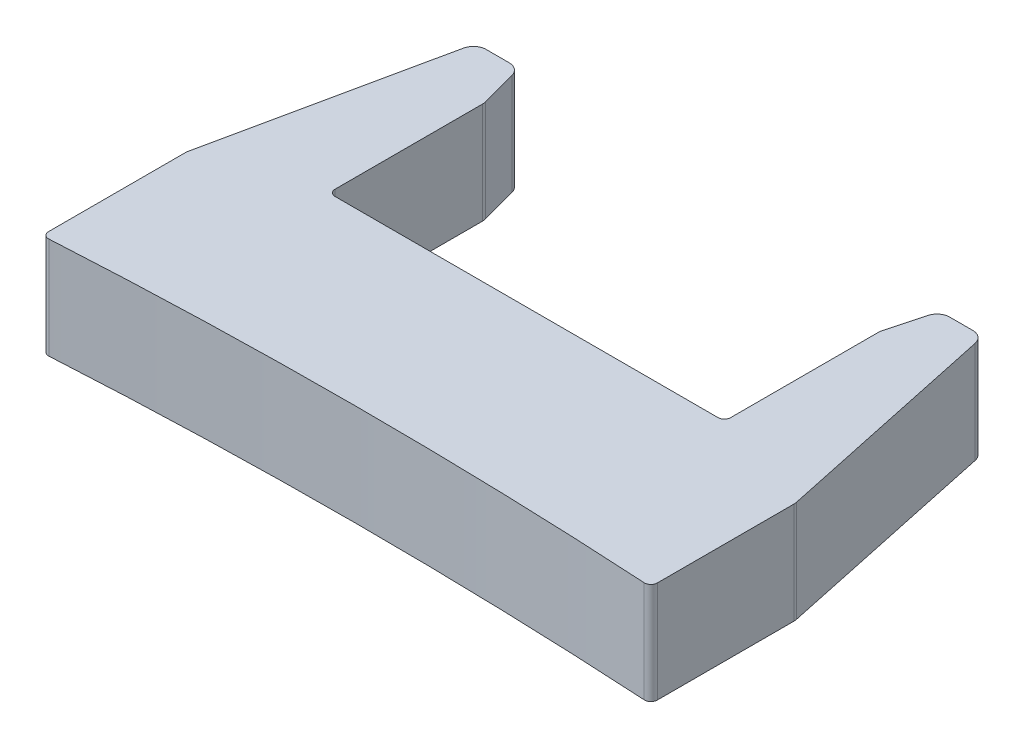
ISO-10303-21;
HEADER;
FILE_DESCRIPTION(('STEP AP214'),'2;1');
FILE_NAME('part.step','',(''),(''),'','','');
FILE_SCHEMA(('AUTOMOTIVE_DESIGN { 1 0 10303 214 1 1 1 1 }'));
ENDSEC;
DATA;
#1=APPLICATION_CONTEXT('core data for automotive mechanical design processes');
#2=APPLICATION_PROTOCOL_DEFINITION('international standard','automotive_design',2000,#1);
#3=PRODUCT_CONTEXT('',#1,'mechanical');
#4=PRODUCT('Part','Part','',(#3));
#5=PRODUCT_RELATED_PRODUCT_CATEGORY('part','',(#4));
#6=PRODUCT_DEFINITION_FORMATION('','',#4);
#7=PRODUCT_DEFINITION_CONTEXT('part definition',#1,'design');
#8=PRODUCT_DEFINITION('design','',#6,#7);
#9=PRODUCT_DEFINITION_SHAPE('','',#8);
#10=(LENGTH_UNIT() NAMED_UNIT(*) SI_UNIT(.MILLI.,.METRE.));
#11=(NAMED_UNIT(*) PLANE_ANGLE_UNIT() SI_UNIT($,.RADIAN.));
#12=(NAMED_UNIT(*) SI_UNIT($,.STERADIAN.) SOLID_ANGLE_UNIT());
#13=UNCERTAINTY_MEASURE_WITH_UNIT(LENGTH_MEASURE(1.E-05),#10,'distance_accuracy_value','');
#14=(GEOMETRIC_REPRESENTATION_CONTEXT(3) GLOBAL_UNCERTAINTY_ASSIGNED_CONTEXT((#13)) GLOBAL_UNIT_ASSIGNED_CONTEXT((#10,
#11,#12)) REPRESENTATION_CONTEXT('',''));
#15=CARTESIAN_POINT('',(0.,0.,0.));
#16=DIRECTION('',(0.,0.,1.));
#17=DIRECTION('',(1.,0.,0.));
#18=AXIS2_PLACEMENT_3D('',#15,#16,#17);
#19=CARTESIAN_POINT('',(-20.,4.,0.));
#20=DIRECTION('',(0.,0.,1.));
#21=DIRECTION('',(1.,0.,0.));
#22=AXIS2_PLACEMENT_3D('',#19,#20,#21);
#23=PLANE('',#22);
#24=CARTESIAN_POINT('',(0.,0.,0.));
#25=DIRECTION('',(0.,0.,-1.));
#26=DIRECTION('',(-1.,0.,0.));
#27=AXIS2_PLACEMENT_3D('',#24,#25,#26);
#28=CIRCLE('',#27,2.49999999999999);
#29=CARTESIAN_POINT('',(-2.49999999999999,0.,0.));
#30=VERTEX_POINT('',#29);
#31=EDGE_CURVE('E216',#30,#30,#28,.T.);
#32=ORIENTED_EDGE('',*,*,#31,.F.);
#33=EDGE_LOOP('',(#32));
#34=FACE_BOUND('',#33,.T.);
#35=DIRECTION('',(-1.,0.,0.));
#36=VECTOR('',#35,1.);
#37=CARTESIAN_POINT('',(-20.,-4.,0.));
#38=LINE('',#37,#36);
#39=CARTESIAN_POINT('',(15.1,-4.,0.));
#40=VERTEX_POINT('',#39);
#41=CARTESIAN_POINT('',(-15.1,-4.,0.));
#42=VERTEX_POINT('',#41);
#43=EDGE_CURVE('E258',#40,#42,#38,.T.);
#44=ORIENTED_EDGE('',*,*,#43,.T.);
#45=DIRECTION('',(0.,1.,0.));
#46=VECTOR('',#45,1.);
#47=CARTESIAN_POINT('',(-15.1,4.,0.));
#48=LINE('',#47,#46);
#49=CARTESIAN_POINT('',(-15.1,4.,0.));
#50=VERTEX_POINT('',#49);
#51=EDGE_CURVE('E380',#42,#50,#48,.T.);
#52=ORIENTED_EDGE('',*,*,#51,.T.);
#53=DIRECTION('',(-1.,0.,0.));
#54=VECTOR('',#53,1.);
#55=CARTESIAN_POINT('',(0.,4.,0.));
#56=LINE('',#55,#54);
#57=CARTESIAN_POINT('',(15.1,4.,0.));
#58=VERTEX_POINT('',#57);
#59=EDGE_CURVE('E264',#58,#50,#56,.T.);
#60=ORIENTED_EDGE('',*,*,#59,.F.);
#61=DIRECTION('',(0.,1.,0.));
#62=VECTOR('',#61,1.);
#63=CARTESIAN_POINT('',(15.1,4.,0.));
#64=LINE('',#63,#62);
#65=EDGE_CURVE('E378',#58,#40,#64,.F.);
#66=ORIENTED_EDGE('',*,*,#65,.T.);
#67=EDGE_LOOP('',(#44,#52,#60,#66));
#68=FACE_BOUND('',#67,.T.);
#69=ADVANCED_FACE('F43',(#34,#68),#23,.F.);
#70=CARTESIAN_POINT('',(-24.,4.,2.8));
#71=DIRECTION('',(1.,0.,0.));
#72=DIRECTION('',(0.,0.,-1.));
#73=AXIS2_PLACEMENT_3D('',#70,#71,#72);
#74=PLANE('',#73);
#75=DIRECTION('',(0.,0.,1.));
#76=VECTOR('',#75,1.);
#77=CARTESIAN_POINT('',(-24.,-4.,2.8));
#78=LINE('',#77,#76);
#79=CARTESIAN_POINT('',(-24.,-4.,2.90520551069358));
#80=VERTEX_POINT('',#79);
#81=CARTESIAN_POINT('',(-24.,-4.,13.6900451464471));
#82=VERTEX_POINT('',#81);
#83=EDGE_CURVE('E285',#80,#82,#78,.T.);
#84=ORIENTED_EDGE('',*,*,#83,.T.);
#85=DIRECTION('',(0.,-1.,0.));
#86=VECTOR('',#85,1.);
#87=CARTESIAN_POINT('',(-24.,4.,13.6900451464471));
#88=LINE('',#87,#86);
#89=CARTESIAN_POINT('',(-24.,4.,13.6900451464471));
#90=VERTEX_POINT('',#89);
#91=EDGE_CURVE('E394',#82,#90,#88,.F.);
#92=ORIENTED_EDGE('',*,*,#91,.T.);
#93=DIRECTION('',(0.,0.,1.));
#94=VECTOR('',#93,1.);
#95=CARTESIAN_POINT('',(-24.,4.,2.8));
#96=LINE('',#95,#94);
#97=CARTESIAN_POINT('',(-24.,4.,2.90520551069358));
#98=VERTEX_POINT('',#97);
#99=EDGE_CURVE('E268',#98,#90,#96,.T.);
#100=ORIENTED_EDGE('',*,*,#99,.F.);
#101=DIRECTION('',(0.,-1.,0.));
#102=VECTOR('',#101,1.);
#103=CARTESIAN_POINT('',(-24.,-4.,2.90520551069358));
#104=LINE('',#103,#102);
#105=EDGE_CURVE('E351',#98,#80,#104,.T.);
#106=ORIENTED_EDGE('',*,*,#105,.T.);
#107=EDGE_LOOP('',(#84,#92,#100,#106));
#108=FACE_BOUND('',#107,.T.);
#109=ADVANCED_FACE('F474',(#108),#74,.F.);
#110=CARTESIAN_POINT('',(0.,4.,413.5));
#111=DIRECTION('',(0.,-1.,0.));
#112=DIRECTION('',(0.,0.,-1.));
#113=AXIS2_PLACEMENT_3D('',#110,#111,#112);
#114=CYLINDRICAL_SURFACE('',#113,400.);
#115=CARTESIAN_POINT('',(0.,4.,413.5));
#116=DIRECTION('',(0.,-1.,0.));
#117=DIRECTION('',(0.,0.,-1.));
#118=AXIS2_PLACEMENT_3D('',#115,#116,#117);
#119=CIRCLE('',#118,400.);
#120=CARTESIAN_POINT('',(-23.4706616729089,4.,14.1891836668636));
#121=VERTEX_POINT('',#120);
#122=CARTESIAN_POINT('',(23.4706616729089,4.,14.1891836668636));
#123=VERTEX_POINT('',#122);
#124=EDGE_CURVE('E273',#121,#123,#119,.T.);
#125=ORIENTED_EDGE('',*,*,#124,.F.);
#126=DIRECTION('',(0.,-1.,0.));
#127=VECTOR('',#126,1.);
#128=CARTESIAN_POINT('',(-23.4706616729089,4.,14.1891836668636));
#129=LINE('',#128,#127);
#130=CARTESIAN_POINT('',(-23.4706616729089,-4.,14.1891836668636));
#131=VERTEX_POINT('',#130);
#132=EDGE_CURVE('E387',#121,#131,#129,.T.);
#133=ORIENTED_EDGE('',*,*,#132,.T.);
#134=CARTESIAN_POINT('',(0.,-4.,413.5));
#135=DIRECTION('',(0.,-1.,0.));
#136=DIRECTION('',(0.,0.,-1.));
#137=AXIS2_PLACEMENT_3D('',#134,#135,#136);
#138=CIRCLE('',#137,400.);
#139=CARTESIAN_POINT('',(23.4706616729089,-4.,14.1891836668636));
#140=VERTEX_POINT('',#139);
#141=EDGE_CURVE('E288',#131,#140,#138,.T.);
#142=ORIENTED_EDGE('',*,*,#141,.T.);
#143=DIRECTION('',(0.,-1.,0.));
#144=VECTOR('',#143,1.);
#145=CARTESIAN_POINT('',(23.4706616729089,4.,14.1891836668636));
#146=LINE('',#145,#144);
#147=EDGE_CURVE('E385',#140,#123,#146,.F.);
#148=ORIENTED_EDGE('',*,*,#147,.T.);
#149=EDGE_LOOP('',(#125,#133,#142,#148));
#150=FACE_BOUND('',#149,.T.);
#151=ADVANCED_FACE('F480',(#150),#114,.F.);
#152=CARTESIAN_POINT('',(24.,4.,2.8));
#153=DIRECTION('',(-1.,0.,0.));
#154=DIRECTION('',(0.,0.,1.));
#155=AXIS2_PLACEMENT_3D('',#152,#153,#154);
#156=PLANE('',#155);
#157=DIRECTION('',(0.,0.,-1.));
#158=VECTOR('',#157,1.);
#159=CARTESIAN_POINT('',(24.,4.,2.8));
#160=LINE('',#159,#158);
#161=CARTESIAN_POINT('',(24.,4.,13.6900451464471));
#162=VERTEX_POINT('',#161);
#163=CARTESIAN_POINT('',(24.,4.,2.90520551069359));
#164=VERTEX_POINT('',#163);
#165=EDGE_CURVE('E279',#162,#164,#160,.T.);
#166=ORIENTED_EDGE('',*,*,#165,.F.);
#167=DIRECTION('',(0.,-1.,0.));
#168=VECTOR('',#167,1.);
#169=CARTESIAN_POINT('',(24.,4.,13.6900451464471));
#170=LINE('',#169,#168);
#171=CARTESIAN_POINT('',(24.,-4.,13.6900451464471));
#172=VERTEX_POINT('',#171);
#173=EDGE_CURVE('E398',#162,#172,#170,.T.);
#174=ORIENTED_EDGE('',*,*,#173,.T.);
#175=DIRECTION('',(0.,0.,-1.));
#176=VECTOR('',#175,1.);
#177=CARTESIAN_POINT('',(24.,-4.,2.8));
#178=LINE('',#177,#176);
#179=CARTESIAN_POINT('',(24.,-4.,2.90520551069359));
#180=VERTEX_POINT('',#179);
#181=EDGE_CURVE('E269',#172,#180,#178,.T.);
#182=ORIENTED_EDGE('',*,*,#181,.T.);
#183=DIRECTION('',(0.,-1.,0.));
#184=VECTOR('',#183,1.);
#185=CARTESIAN_POINT('',(24.,4.,2.90520551069359));
#186=LINE('',#185,#184);
#187=EDGE_CURVE('E348',#180,#164,#186,.F.);
#188=ORIENTED_EDGE('',*,*,#187,.T.);
#189=EDGE_LOOP('',(#166,#174,#182,#188));
#190=FACE_BOUND('',#189,.T.);
#191=ADVANCED_FACE('F706',(#190),#156,.F.);
#192=CARTESIAN_POINT('',(0.,4.,413.5));
#193=DIRECTION('',(0.,-1.,0.));
#194=DIRECTION('',(0.,0.,-1.));
#195=AXIS2_PLACEMENT_3D('',#192,#193,#194);
#196=PLANE('',#195);
#197=ORIENTED_EDGE('',*,*,#99,.T.);
#198=CARTESIAN_POINT('',(-23.5,4.,13.6900451464471));
#199=DIRECTION('',(0.,-1.,0.));
#200=DIRECTION('',(0.,0.,-1.));
#201=AXIS2_PLACEMENT_3D('',#198,#199,#200);
#202=CIRCLE('',#201,0.5);
#203=EDGE_CURVE('E397',#90,#121,#202,.F.);
#204=ORIENTED_EDGE('',*,*,#203,.T.);
#205=ORIENTED_EDGE('',*,*,#124,.T.);
#206=CARTESIAN_POINT('',(23.5,4.,13.6900451464471));
#207=DIRECTION('',(0.,-1.,0.));
#208=DIRECTION('',(0.,0.,-1.));
#209=AXIS2_PLACEMENT_3D('',#206,#207,#208);
#210=CIRCLE('',#209,0.5);
#211=EDGE_CURVE('E58',#123,#162,#210,.F.);
#212=ORIENTED_EDGE('',*,*,#211,.T.);
#213=ORIENTED_EDGE('',*,*,#165,.T.);
#214=CARTESIAN_POINT('',(23.,4.,2.90520551069359));
#215=DIRECTION('',(0.,-1.,0.));
#216=DIRECTION('',(0.,0.,-1.));
#217=AXIS2_PLACEMENT_3D('',#214,#215,#216);
#218=CIRCLE('',#217,1.);
#219=CARTESIAN_POINT('',(23.9781059289848,4.,2.69709786622873));
#220=VERTEX_POINT('',#219);
#221=EDGE_CURVE('E321',#164,#220,#218,.F.);
#222=ORIENTED_EDGE('',*,*,#221,.T.);
#223=DIRECTION('',(-0.208107644464859,0.,-0.978105928984835));
#224=VECTOR('',#223,1.);
#225=CARTESIAN_POINT('',(20.,4.,-16.));
#226=LINE('',#225,#224);
#227=CARTESIAN_POINT('',(20.1684877352202,4.,-15.2081076444649));
#228=VERTEX_POINT('',#227);
#229=EDGE_CURVE('E215',#220,#228,#226,.T.);
#230=ORIENTED_EDGE('',*,*,#229,.T.);
#231=CARTESIAN_POINT('',(19.1903818062354,4.,-15.));
#232=DIRECTION('',(0.,-1.,0.));
#233=DIRECTION('',(0.,0.,-1.));
#234=AXIS2_PLACEMENT_3D('',#231,#232,#233);
#235=CIRCLE('',#234,1.);
#236=CARTESIAN_POINT('',(19.1903818062354,4.,-16.));
#237=VERTEX_POINT('',#236);
#238=EDGE_CURVE('E323',#228,#237,#235,.F.);
#239=ORIENTED_EDGE('',*,*,#238,.T.);
#240=DIRECTION('',(-1.,0.,0.));
#241=VECTOR('',#240,1.);
#242=CARTESIAN_POINT('',(20.,4.,-16.));
#243=LINE('',#242,#241);
#244=CARTESIAN_POINT('',(17.367326987979,4.,-16.));
#245=VERTEX_POINT('',#244);
#246=EDGE_CURVE('E219',#237,#245,#243,.T.);
#247=ORIENTED_EDGE('',*,*,#246,.T.);
#248=CARTESIAN_POINT('',(17.367326987979,4.,-15.));
#249=DIRECTION('',(0.,-1.,0.));
#250=DIRECTION('',(0.,0.,-1.));
#251=AXIS2_PLACEMENT_3D('',#248,#249,#250);
#252=CIRCLE('',#251,1.);
#253=CARTESIAN_POINT('',(16.4014011616899,4.,-15.2588190451025));
#254=VERTEX_POINT('',#253);
#255=EDGE_CURVE('E315',#245,#254,#252,.F.);
#256=ORIENTED_EDGE('',*,*,#255,.T.);
#257=DIRECTION('',(0.258819045102521,0.,-0.965925826289068));
#258=VECTOR('',#257,1.);
#259=CARTESIAN_POINT('',(16.6,4.,-16.));
#260=LINE('',#259,#258);
#261=CARTESIAN_POINT('',(15.6340741737109,4.,-12.3951157399463));
#262=VERTEX_POINT('',#261);
#263=EDGE_CURVE('E294',#254,#262,#260,.F.);
#264=ORIENTED_EDGE('',*,*,#263,.T.);
#265=CARTESIAN_POINT('',(16.6,4.,-12.1362966948437));
#266=DIRECTION('',(0.,-1.,0.));
#267=DIRECTION('',(0.,0.,-1.));
#268=AXIS2_PLACEMENT_3D('',#265,#266,#267);
#269=CIRCLE('',#268,1.);
#270=CARTESIAN_POINT('',(15.6,4.,-12.1362966948437));
#271=VERTEX_POINT('',#270);
#272=EDGE_CURVE('E313',#262,#271,#269,.F.);
#273=ORIENTED_EDGE('',*,*,#272,.T.);
#274=DIRECTION('',(0.,0.,1.));
#275=VECTOR('',#274,1.);
#276=CARTESIAN_POINT('',(15.6,4.,-16.));
#277=LINE('',#276,#275);
#278=CARTESIAN_POINT('',(15.6,4.,-0.5));
#279=VERTEX_POINT('',#278);
#280=EDGE_CURVE('E224',#271,#279,#277,.T.);
#281=ORIENTED_EDGE('',*,*,#280,.T.);
#282=CARTESIAN_POINT('',(15.1,4.,-0.5));
#283=DIRECTION('',(0.,-1.,0.));
#284=DIRECTION('',(0.,0.,-1.));
#285=AXIS2_PLACEMENT_3D('',#282,#283,#284);
#286=CIRCLE('',#285,0.5);
#287=EDGE_CURVE('E51',#279,#58,#286,.T.);
#288=ORIENTED_EDGE('',*,*,#287,.T.);
#289=ORIENTED_EDGE('',*,*,#59,.T.);
#290=CARTESIAN_POINT('',(-15.1,4.,-0.5));
#291=DIRECTION('',(0.,-1.,0.));
#292=DIRECTION('',(0.,0.,-1.));
#293=AXIS2_PLACEMENT_3D('',#290,#291,#292);
#294=CIRCLE('',#293,0.5);
#295=CARTESIAN_POINT('',(-15.6,4.,-0.5));
#296=VERTEX_POINT('',#295);
#297=EDGE_CURVE('E241',#50,#296,#294,.T.);
#298=ORIENTED_EDGE('',*,*,#297,.T.);
#299=DIRECTION('',(0.,0.,-1.));
#300=VECTOR('',#299,1.);
#301=CARTESIAN_POINT('',(-15.6,4.,-16.));
#302=LINE('',#301,#300);
#303=CARTESIAN_POINT('',(-15.6,4.,-12.1362966948437));
#304=VERTEX_POINT('',#303);
#305=EDGE_CURVE('E249',#296,#304,#302,.T.);
#306=ORIENTED_EDGE('',*,*,#305,.T.);
#307=CARTESIAN_POINT('',(-16.6,4.,-12.1362966948437));
#308=DIRECTION('',(0.,-1.,0.));
#309=DIRECTION('',(0.,0.,-1.));
#310=AXIS2_PLACEMENT_3D('',#307,#308,#309);
#311=CIRCLE('',#310,1.);
#312=CARTESIAN_POINT('',(-15.6340741737109,4.,-12.3951157399463));
#313=VERTEX_POINT('',#312);
#314=EDGE_CURVE('E311',#304,#313,#311,.F.);
#315=ORIENTED_EDGE('',*,*,#314,.T.);
#316=DIRECTION('',(0.258819045102521,0.,0.965925826289068));
#317=VECTOR('',#316,1.);
#318=CARTESIAN_POINT('',(-15.6,4.,-12.2679491924311));
#319=LINE('',#318,#317);
#320=CARTESIAN_POINT('',(-16.4014011616899,4.,-15.2588190451025));
#321=VERTEX_POINT('',#320);
#322=EDGE_CURVE('E282',#313,#321,#319,.F.);
#323=ORIENTED_EDGE('',*,*,#322,.T.);
#324=CARTESIAN_POINT('',(-17.367326987979,4.,-15.));
#325=DIRECTION('',(0.,-1.,0.));
#326=DIRECTION('',(0.,0.,-1.));
#327=AXIS2_PLACEMENT_3D('',#324,#325,#326);
#328=CIRCLE('',#327,1.);
#329=CARTESIAN_POINT('',(-17.367326987979,4.,-16.));
#330=VERTEX_POINT('',#329);
#331=EDGE_CURVE('E309',#321,#330,#328,.F.);
#332=ORIENTED_EDGE('',*,*,#331,.T.);
#333=DIRECTION('',(-1.,0.,0.));
#334=VECTOR('',#333,1.);
#335=CARTESIAN_POINT('',(-20.,4.,-16.));
#336=LINE('',#335,#334);
#337=CARTESIAN_POINT('',(-19.1903818062354,4.,-16.));
#338=VERTEX_POINT('',#337);
#339=EDGE_CURVE('E252',#330,#338,#336,.T.);
#340=ORIENTED_EDGE('',*,*,#339,.T.);
#341=CARTESIAN_POINT('',(-19.1903818062354,4.,-15.));
#342=DIRECTION('',(0.,-1.,0.));
#343=DIRECTION('',(0.,0.,-1.));
#344=AXIS2_PLACEMENT_3D('',#341,#342,#343);
#345=CIRCLE('',#344,1.);
#346=CARTESIAN_POINT('',(-20.1684877352202,4.,-15.2081076444649));
#347=VERTEX_POINT('',#346);
#348=EDGE_CURVE('E317',#338,#347,#345,.F.);
#349=ORIENTED_EDGE('',*,*,#348,.T.);
#350=DIRECTION('',(-0.208107644464859,0.,0.978105928984835));
#351=VECTOR('',#350,1.);
#352=CARTESIAN_POINT('',(-20.,4.,-16.));
#353=LINE('',#352,#351);
#354=CARTESIAN_POINT('',(-23.9781059289848,4.,2.69709786622873));
#355=VERTEX_POINT('',#354);
#356=EDGE_CURVE('E263',#347,#355,#353,.T.);
#357=ORIENTED_EDGE('',*,*,#356,.T.);
#358=CARTESIAN_POINT('',(-23.,4.,2.90520551069358));
#359=DIRECTION('',(0.,-1.,0.));
#360=DIRECTION('',(0.,0.,-1.));
#361=AXIS2_PLACEMENT_3D('',#358,#359,#360);
#362=CIRCLE('',#361,1.);
#363=EDGE_CURVE('E319',#355,#98,#362,.F.);
#364=ORIENTED_EDGE('',*,*,#363,.T.);
#365=EDGE_LOOP('',(#197,#204,#205,#212,#213,#222,#230,#239,#247,#256,#264,#273,#281,#288,#289,
#298,#306,#315,#323,#332,#340,#349,#357,#364));
#366=FACE_BOUND('',#365,.T.);
#367=ADVANCED_FACE('F409',(#366),#196,.F.);
#368=CARTESIAN_POINT('',(0.,-4.,413.5));
#369=DIRECTION('',(0.,-1.,0.));
#370=DIRECTION('',(0.,0.,-1.));
#371=AXIS2_PLACEMENT_3D('',#368,#369,#370);
#372=PLANE('',#371);
#373=ORIENTED_EDGE('',*,*,#141,.F.);
#374=CARTESIAN_POINT('',(-23.5,-4.,13.6900451464471));
#375=DIRECTION('',(0.,-1.,0.));
#376=DIRECTION('',(0.,0.,-1.));
#377=AXIS2_PLACEMENT_3D('',#374,#375,#376);
#378=CIRCLE('',#377,0.5);
#379=EDGE_CURVE('E392',#131,#82,#378,.T.);
#380=ORIENTED_EDGE('',*,*,#379,.T.);
#381=ORIENTED_EDGE('',*,*,#83,.F.);
#382=CARTESIAN_POINT('',(-23.,-4.,2.90520551069358));
#383=DIRECTION('',(0.,-1.,0.));
#384=DIRECTION('',(0.,0.,-1.));
#385=AXIS2_PLACEMENT_3D('',#382,#383,#384);
#386=CIRCLE('',#385,1.);
#387=CARTESIAN_POINT('',(-23.9781059289848,-4.,2.69709786622873));
#388=VERTEX_POINT('',#387);
#389=EDGE_CURVE('E341',#80,#388,#386,.T.);
#390=ORIENTED_EDGE('',*,*,#389,.T.);
#391=DIRECTION('',(-0.208107644464859,0.,0.978105928984835));
#392=VECTOR('',#391,1.);
#393=CARTESIAN_POINT('',(-20.,-4.,-16.));
#394=LINE('',#393,#392);
#395=CARTESIAN_POINT('',(-20.1684877352202,-4.,-15.2081076444649));
#396=VERTEX_POINT('',#395);
#397=EDGE_CURVE('E255',#396,#388,#394,.T.);
#398=ORIENTED_EDGE('',*,*,#397,.F.);
#399=CARTESIAN_POINT('',(-19.1903818062354,-4.,-15.));
#400=DIRECTION('',(0.,-1.,0.));
#401=DIRECTION('',(0.,0.,-1.));
#402=AXIS2_PLACEMENT_3D('',#399,#400,#401);
#403=CIRCLE('',#402,1.);
#404=CARTESIAN_POINT('',(-19.1903818062354,-4.,-16.));
#405=VERTEX_POINT('',#404);
#406=EDGE_CURVE('E339',#396,#405,#403,.T.);
#407=ORIENTED_EDGE('',*,*,#406,.T.);
#408=DIRECTION('',(-1.,0.,0.));
#409=VECTOR('',#408,1.);
#410=CARTESIAN_POINT('',(-20.,-4.,-16.));
#411=LINE('',#410,#409);
#412=CARTESIAN_POINT('',(-17.367326987979,-4.,-16.));
#413=VERTEX_POINT('',#412);
#414=EDGE_CURVE('E259',#413,#405,#411,.T.);
#415=ORIENTED_EDGE('',*,*,#414,.F.);
#416=CARTESIAN_POINT('',(-17.367326987979,-4.,-15.));
#417=DIRECTION('',(0.,-1.,0.));
#418=DIRECTION('',(0.,0.,-1.));
#419=AXIS2_PLACEMENT_3D('',#416,#417,#418);
#420=CIRCLE('',#419,1.);
#421=CARTESIAN_POINT('',(-16.4014011616899,-4.,-15.2588190451026));
#422=VERTEX_POINT('',#421);
#423=EDGE_CURVE('E330',#413,#422,#420,.T.);
#424=ORIENTED_EDGE('',*,*,#423,.T.);
#425=DIRECTION('',(-0.258819045102521,0.,-0.965925826289068));
#426=VECTOR('',#425,1.);
#427=CARTESIAN_POINT('',(91.8869891485892,-4.,388.878955462708));
#428=LINE('',#427,#426);
#429=CARTESIAN_POINT('',(-15.634074173711,-4.,-12.3951157399463));
#430=VERTEX_POINT('',#429);
#431=EDGE_CURVE('E297',#422,#430,#428,.F.);
#432=ORIENTED_EDGE('',*,*,#431,.T.);
#433=CARTESIAN_POINT('',(-16.6,-4.,-12.1362966948437));
#434=DIRECTION('',(0.,-1.,0.));
#435=DIRECTION('',(0.,0.,-1.));
#436=AXIS2_PLACEMENT_3D('',#433,#434,#435);
#437=CIRCLE('',#436,1.);
#438=CARTESIAN_POINT('',(-15.6,-4.,-12.1362966948437));
#439=VERTEX_POINT('',#438);
#440=EDGE_CURVE('E332',#430,#439,#437,.T.);
#441=ORIENTED_EDGE('',*,*,#440,.T.);
#442=DIRECTION('',(0.,0.,-1.));
#443=VECTOR('',#442,1.);
#444=CARTESIAN_POINT('',(-15.6,-4.,-16.));
#445=LINE('',#444,#443);
#446=CARTESIAN_POINT('',(-15.6,-4.,-0.5));
#447=VERTEX_POINT('',#446);
#448=EDGE_CURVE('E262',#447,#439,#445,.T.);
#449=ORIENTED_EDGE('',*,*,#448,.F.);
#450=CARTESIAN_POINT('',(-15.1,-4.,-0.5));
#451=DIRECTION('',(0.,-1.,0.));
#452=DIRECTION('',(0.,0.,-1.));
#453=AXIS2_PLACEMENT_3D('',#450,#451,#452);
#454=CIRCLE('',#453,0.5);
#455=EDGE_CURVE('E239',#447,#42,#454,.F.);
#456=ORIENTED_EDGE('',*,*,#455,.T.);
#457=ORIENTED_EDGE('',*,*,#43,.F.);
#458=CARTESIAN_POINT('',(15.1,-4.,-0.5));
#459=DIRECTION('',(0.,-1.,0.));
#460=DIRECTION('',(0.,0.,-1.));
#461=AXIS2_PLACEMENT_3D('',#458,#459,#460);
#462=CIRCLE('',#461,0.5);
#463=CARTESIAN_POINT('',(15.6,-4.,-0.5));
#464=VERTEX_POINT('',#463);
#465=EDGE_CURVE('E12',#40,#464,#462,.F.);
#466=ORIENTED_EDGE('',*,*,#465,.T.);
#467=DIRECTION('',(0.,0.,1.));
#468=VECTOR('',#467,1.);
#469=CARTESIAN_POINT('',(15.6,-4.,-16.));
#470=LINE('',#469,#468);
#471=CARTESIAN_POINT('',(15.6,-4.,-12.1362966948437));
#472=VERTEX_POINT('',#471);
#473=EDGE_CURVE('E253',#472,#464,#470,.T.);
#474=ORIENTED_EDGE('',*,*,#473,.F.);
#475=CARTESIAN_POINT('',(16.6,-4.,-12.1362966948437));
#476=DIRECTION('',(0.,-1.,0.));
#477=DIRECTION('',(0.,0.,-1.));
#478=AXIS2_PLACEMENT_3D('',#475,#476,#477);
#479=CIRCLE('',#478,1.);
#480=CARTESIAN_POINT('',(15.634074173711,-4.,-12.3951157399463));
#481=VERTEX_POINT('',#480);
#482=EDGE_CURVE('E335',#472,#481,#479,.T.);
#483=ORIENTED_EDGE('',*,*,#482,.T.);
#484=DIRECTION('',(-0.258819045102521,0.,0.965925826289068));
#485=VECTOR('',#484,1.);
#486=CARTESIAN_POINT('',(-91.8869891485892,-4.,388.878955462708));
#487=LINE('',#486,#485);
#488=CARTESIAN_POINT('',(16.4014011616899,-4.,-15.2588190451026));
#489=VERTEX_POINT('',#488);
#490=EDGE_CURVE('E300',#481,#489,#487,.F.);
#491=ORIENTED_EDGE('',*,*,#490,.T.);
#492=CARTESIAN_POINT('',(17.367326987979,-4.,-15.));
#493=DIRECTION('',(0.,-1.,0.));
#494=DIRECTION('',(0.,0.,-1.));
#495=AXIS2_PLACEMENT_3D('',#492,#493,#494);
#496=CIRCLE('',#495,1.);
#497=CARTESIAN_POINT('',(17.367326987979,-4.,-16.));
#498=VERTEX_POINT('',#497);
#499=EDGE_CURVE('E337',#489,#498,#496,.T.);
#500=ORIENTED_EDGE('',*,*,#499,.T.);
#501=DIRECTION('',(-1.,0.,0.));
#502=VECTOR('',#501,1.);
#503=CARTESIAN_POINT('',(20.,-4.,-16.));
#504=LINE('',#503,#502);
#505=CARTESIAN_POINT('',(19.1903818062354,-4.,-16.));
#506=VERTEX_POINT('',#505);
#507=EDGE_CURVE('E421',#506,#498,#504,.T.);
#508=ORIENTED_EDGE('',*,*,#507,.F.);
#509=CARTESIAN_POINT('',(19.1903818062354,-4.,-15.));
#510=DIRECTION('',(0.,-1.,0.));
#511=DIRECTION('',(0.,0.,-1.));
#512=AXIS2_PLACEMENT_3D('',#509,#510,#511);
#513=CIRCLE('',#512,1.);
#514=CARTESIAN_POINT('',(20.1684877352202,-4.,-15.2081076444649));
#515=VERTEX_POINT('',#514);
#516=EDGE_CURVE('E346',#506,#515,#513,.T.);
#517=ORIENTED_EDGE('',*,*,#516,.T.);
#518=DIRECTION('',(-0.208107644464859,0.,-0.978105928984835));
#519=VECTOR('',#518,1.);
#520=CARTESIAN_POINT('',(20.,-4.,-16.));
#521=LINE('',#520,#519);
#522=CARTESIAN_POINT('',(23.9781059289848,-4.,2.69709786622873));
#523=VERTEX_POINT('',#522);
#524=EDGE_CURVE('E228',#523,#515,#521,.T.);
#525=ORIENTED_EDGE('',*,*,#524,.F.);
#526=CARTESIAN_POINT('',(23.,-4.,2.90520551069359));
#527=DIRECTION('',(0.,-1.,0.));
#528=DIRECTION('',(0.,0.,-1.));
#529=AXIS2_PLACEMENT_3D('',#526,#527,#528);
#530=CIRCLE('',#529,1.);
#531=EDGE_CURVE('E343',#523,#180,#530,.T.);
#532=ORIENTED_EDGE('',*,*,#531,.T.);
#533=ORIENTED_EDGE('',*,*,#181,.F.);
#534=CARTESIAN_POINT('',(23.5,-4.,13.6900451464471));
#535=DIRECTION('',(0.,-1.,0.));
#536=DIRECTION('',(0.,0.,-1.));
#537=AXIS2_PLACEMENT_3D('',#534,#535,#536);
#538=CIRCLE('',#537,0.5);
#539=EDGE_CURVE('E390',#172,#140,#538,.T.);
#540=ORIENTED_EDGE('',*,*,#539,.T.);
#541=EDGE_LOOP('',(#373,#380,#381,#390,#398,#407,#415,#424,#432,#441,#449,#456,#457,#466,#474,
#483,#491,#500,#508,#517,#525,#532,#533,#540));
#542=FACE_BOUND('',#541,.T.);
#543=ADVANCED_FACE('F418',(#542),#372,.T.);
#544=CARTESIAN_POINT('',(-15.6,-24.591260281974,-16.));
#545=DIRECTION('',(1.,0.,0.));
#546=DIRECTION('',(0.,0.,-1.));
#547=AXIS2_PLACEMENT_3D('',#544,#545,#546);
#548=PLANE('',#547);
#549=ORIENTED_EDGE('',*,*,#305,.F.);
#550=DIRECTION('',(0.,1.,0.));
#551=VECTOR('',#550,1.);
#552=CARTESIAN_POINT('',(-15.6,-24.591260281974,-0.5));
#553=LINE('',#552,#551);
#554=EDGE_CURVE('E383',#296,#447,#553,.F.);
#555=ORIENTED_EDGE('',*,*,#554,.T.);
#556=ORIENTED_EDGE('',*,*,#448,.T.);
#557=DIRECTION('',(0.,-1.,0.));
#558=VECTOR('',#557,1.);
#559=CARTESIAN_POINT('',(-15.6,-24.591260281974,-12.1362966948437));
#560=LINE('',#559,#558);
#561=EDGE_CURVE('E371',#439,#304,#560,.F.);
#562=ORIENTED_EDGE('',*,*,#561,.T.);
#563=EDGE_LOOP('',(#549,#555,#556,#562));
#564=FACE_BOUND('',#563,.T.);
#565=ADVANCED_FACE('F462',(#564),#548,.T.);
#566=CARTESIAN_POINT('',(-20.,-24.591260281974,-16.));
#567=DIRECTION('',(0.,0.,-1.));
#568=DIRECTION('',(-1.,0.,0.));
#569=AXIS2_PLACEMENT_3D('',#566,#567,#568);
#570=PLANE('',#569);
#571=ORIENTED_EDGE('',*,*,#414,.T.);
#572=DIRECTION('',(0.,1.,0.));
#573=VECTOR('',#572,1.);
#574=CARTESIAN_POINT('',(-19.1903818062354,-24.591260281974,-16.));
#575=LINE('',#574,#573);
#576=EDGE_CURVE('E361',#405,#338,#575,.T.);
#577=ORIENTED_EDGE('',*,*,#576,.T.);
#578=ORIENTED_EDGE('',*,*,#339,.F.);
#579=DIRECTION('',(0.,1.,0.));
#580=VECTOR('',#579,1.);
#581=CARTESIAN_POINT('',(-17.367326987979,-24.591260281974,-16.));
#582=LINE('',#581,#580);
#583=EDGE_CURVE('E358',#330,#413,#582,.F.);
#584=ORIENTED_EDGE('',*,*,#583,.T.);
#585=EDGE_LOOP('',(#571,#577,#578,#584));
#586=FACE_BOUND('',#585,.T.);
#587=ADVANCED_FACE('F437',(#586),#570,.T.);
#588=CARTESIAN_POINT('',(-20.,-24.591260281974,-16.));
#589=DIRECTION('',(-0.978105928984835,0.,-0.208107644464859));
#590=DIRECTION('',(-0.208107644464859,0.,0.978105928984835));
#591=AXIS2_PLACEMENT_3D('',#588,#589,#590);
#592=PLANE('',#591);
#593=ORIENTED_EDGE('',*,*,#397,.T.);
#594=DIRECTION('',(0.,-1.,0.));
#595=VECTOR('',#594,1.);
#596=CARTESIAN_POINT('',(-23.9781059289848,4.,2.69709786622873));
#597=LINE('',#596,#595);
#598=EDGE_CURVE('E356',#388,#355,#597,.F.);
#599=ORIENTED_EDGE('',*,*,#598,.T.);
#600=ORIENTED_EDGE('',*,*,#356,.F.);
#601=DIRECTION('',(0.,1.,0.));
#602=VECTOR('',#601,1.);
#603=CARTESIAN_POINT('',(-20.1684877352202,-24.591260281974,-15.2081076444649));
#604=LINE('',#603,#602);
#605=EDGE_CURVE('E354',#347,#396,#604,.F.);
#606=ORIENTED_EDGE('',*,*,#605,.T.);
#607=EDGE_LOOP('',(#593,#599,#600,#606));
#608=FACE_BOUND('',#607,.T.);
#609=ADVANCED_FACE('F469',(#608),#592,.T.);
#610=CARTESIAN_POINT('',(20.,-24.591260281974,-16.));
#611=DIRECTION('',(0.978105928984835,0.,-0.208107644464859));
#612=DIRECTION('',(-0.208107644464859,0.,-0.978105928984835));
#613=AXIS2_PLACEMENT_3D('',#610,#611,#612);
#614=PLANE('',#613);
#615=ORIENTED_EDGE('',*,*,#524,.T.);
#616=DIRECTION('',(0.,1.,0.));
#617=VECTOR('',#616,1.);
#618=CARTESIAN_POINT('',(20.1684877352202,-24.591260281974,-15.2081076444649));
#619=LINE('',#618,#617);
#620=EDGE_CURVE('E306',#515,#228,#619,.T.);
#621=ORIENTED_EDGE('',*,*,#620,.T.);
#622=ORIENTED_EDGE('',*,*,#229,.F.);
#623=DIRECTION('',(0.,-1.,0.));
#624=VECTOR('',#623,1.);
#625=CARTESIAN_POINT('',(23.9781059289848,-4.,2.69709786622873));
#626=LINE('',#625,#624);
#627=EDGE_CURVE('E303',#220,#523,#626,.T.);
#628=ORIENTED_EDGE('',*,*,#627,.T.);
#629=EDGE_LOOP('',(#615,#621,#622,#628));
#630=FACE_BOUND('',#629,.T.);
#631=ADVANCED_FACE('F550',(#630),#614,.T.);
#632=CARTESIAN_POINT('',(20.,-24.591260281974,-16.));
#633=DIRECTION('',(0.,0.,-1.));
#634=DIRECTION('',(-1.,0.,0.));
#635=AXIS2_PLACEMENT_3D('',#632,#633,#634);
#636=PLANE('',#635);
#637=ORIENTED_EDGE('',*,*,#246,.F.);
#638=DIRECTION('',(0.,1.,0.));
#639=VECTOR('',#638,1.);
#640=CARTESIAN_POINT('',(19.1903818062354,-24.591260281974,-16.));
#641=LINE('',#640,#639);
#642=EDGE_CURVE('E328',#237,#506,#641,.F.);
#643=ORIENTED_EDGE('',*,*,#642,.T.);
#644=ORIENTED_EDGE('',*,*,#507,.T.);
#645=DIRECTION('',(0.,-1.,0.));
#646=VECTOR('',#645,1.);
#647=CARTESIAN_POINT('',(17.367326987979,-24.591260281974,-16.));
#648=LINE('',#647,#646);
#649=EDGE_CURVE('E325',#498,#245,#648,.F.);
#650=ORIENTED_EDGE('',*,*,#649,.T.);
#651=EDGE_LOOP('',(#637,#643,#644,#650));
#652=FACE_BOUND('',#651,.T.);
#653=ADVANCED_FACE('F555',(#652),#636,.T.);
#654=CARTESIAN_POINT('',(15.6,-24.591260281974,-16.));
#655=DIRECTION('',(-1.,0.,0.));
#656=DIRECTION('',(0.,0.,1.));
#657=AXIS2_PLACEMENT_3D('',#654,#655,#656);
#658=PLANE('',#657);
#659=ORIENTED_EDGE('',*,*,#473,.T.);
#660=DIRECTION('',(0.,1.,0.));
#661=VECTOR('',#660,1.);
#662=CARTESIAN_POINT('',(15.6,-24.591260281974,-0.5));
#663=LINE('',#662,#661);
#664=EDGE_CURVE('E244',#464,#279,#663,.T.);
#665=ORIENTED_EDGE('',*,*,#664,.T.);
#666=ORIENTED_EDGE('',*,*,#280,.F.);
#667=DIRECTION('',(0.,1.,0.));
#668=VECTOR('',#667,1.);
#669=CARTESIAN_POINT('',(15.6,-24.591260281974,-12.1362966948437));
#670=LINE('',#669,#668);
#671=EDGE_CURVE('E368',#271,#472,#670,.F.);
#672=ORIENTED_EDGE('',*,*,#671,.T.);
#673=EDGE_LOOP('',(#659,#665,#666,#672));
#674=FACE_BOUND('',#673,.T.);
#675=ADVANCED_FACE('F209',(#674),#658,.T.);
#676=CARTESIAN_POINT('',(0.,0.,11.));
#677=DIRECTION('',(0.,0.,-1.));
#678=DIRECTION('',(-1.,0.,0.));
#679=AXIS2_PLACEMENT_3D('',#676,#677,#678);
#680=CONICAL_SURFACE('',#679,2.5,1.02974425867665);
#681=CARTESIAN_POINT('',(0.,0.,12.5021515475689));
#682=VERTEX_POINT('',#681);
#683=VERTEX_LOOP('',#682);
#684=FACE_BOUND('',#683,.T.);
#685=CARTESIAN_POINT('',(0.,0.,11.));
#686=DIRECTION('',(0.,0.,-1.));
#687=DIRECTION('',(-1.,0.,0.));
#688=AXIS2_PLACEMENT_3D('',#685,#686,#687);
#689=CIRCLE('',#688,2.5);
#690=CARTESIAN_POINT('',(-2.5,0.,11.));
#691=VERTEX_POINT('',#690);
#692=EDGE_CURVE('E213',#691,#691,#689,.T.);
#693=ORIENTED_EDGE('',*,*,#692,.T.);
#694=EDGE_LOOP('',(#693));
#695=FACE_BOUND('',#694,.T.);
#696=ADVANCED_FACE('F205',(#684,#695),#680,.F.);
#697=CARTESIAN_POINT('',(0.,0.,0.));
#698=DIRECTION('',(0.,0.,-1.));
#699=DIRECTION('',(-1.,0.,0.));
#700=AXIS2_PLACEMENT_3D('',#697,#698,#699);
#701=CYLINDRICAL_SURFACE('',#700,2.49999999999999);
#702=ORIENTED_EDGE('',*,*,#692,.F.);
#703=EDGE_LOOP('',(#702));
#704=FACE_BOUND('',#703,.T.);
#705=ORIENTED_EDGE('',*,*,#31,.T.);
#706=EDGE_LOOP('',(#705));
#707=FACE_BOUND('',#706,.T.);
#708=ADVANCED_FACE('F208',(#704,#707),#701,.F.);
#709=CARTESIAN_POINT('',(16.6,-24.591260281974,-16.));
#710=DIRECTION('',(0.965925826289068,0.,0.258819045102521));
#711=DIRECTION('',(0.,1.,0.));
#712=AXIS2_PLACEMENT_3D('',#709,#710,#711);
#713=PLANE('',#712);
#714=ORIENTED_EDGE('',*,*,#263,.F.);
#715=DIRECTION('',(0.,1.,0.));
#716=VECTOR('',#715,1.);
#717=CARTESIAN_POINT('',(16.4014011616899,-24.591260281974,-15.2588190451025));
#718=LINE('',#717,#716);
#719=EDGE_CURVE('E366',#254,#489,#718,.F.);
#720=ORIENTED_EDGE('',*,*,#719,.T.);
#721=ORIENTED_EDGE('',*,*,#490,.F.);
#722=DIRECTION('',(0.,-1.,0.));
#723=VECTOR('',#722,1.);
#724=CARTESIAN_POINT('',(15.6340741737109,-24.591260281974,-12.3951157399463));
#725=LINE('',#724,#723);
#726=EDGE_CURVE('E364',#481,#262,#725,.F.);
#727=ORIENTED_EDGE('',*,*,#726,.T.);
#728=EDGE_LOOP('',(#714,#720,#721,#727));
#729=FACE_BOUND('',#728,.T.);
#730=ADVANCED_FACE('F487',(#729),#713,.F.);
#731=CARTESIAN_POINT('',(-15.6,-24.591260281974,-12.2679491924311));
#732=DIRECTION('',(-0.965925826289068,0.,0.258819045102521));
#733=DIRECTION('',(0.,1.,0.));
#734=AXIS2_PLACEMENT_3D('',#731,#732,#733);
#735=PLANE('',#734);
#736=ORIENTED_EDGE('',*,*,#322,.F.);
#737=DIRECTION('',(0.,1.,0.));
#738=VECTOR('',#737,1.);
#739=CARTESIAN_POINT('',(-15.6340741737109,-24.591260281974,-12.3951157399463));
#740=LINE('',#739,#738);
#741=EDGE_CURVE('E376',#313,#430,#740,.F.);
#742=ORIENTED_EDGE('',*,*,#741,.T.);
#743=ORIENTED_EDGE('',*,*,#431,.F.);
#744=DIRECTION('',(0.,-1.,0.));
#745=VECTOR('',#744,1.);
#746=CARTESIAN_POINT('',(-16.4014011616899,-24.591260281974,-15.2588190451025));
#747=LINE('',#746,#745);
#748=EDGE_CURVE('E374',#422,#321,#747,.F.);
#749=ORIENTED_EDGE('',*,*,#748,.T.);
#750=EDGE_LOOP('',(#736,#742,#743,#749));
#751=FACE_BOUND('',#750,.T.);
#752=ADVANCED_FACE('F447',(#751),#735,.F.);
#753=CARTESIAN_POINT('',(19.1903818062354,-24.591260281974,-15.));
#754=DIRECTION('',(0.,1.,0.));
#755=DIRECTION('',(0.,0.,1.));
#756=AXIS2_PLACEMENT_3D('',#753,#754,#755);
#757=CYLINDRICAL_SURFACE('',#756,1.);
#758=ORIENTED_EDGE('',*,*,#516,.F.);
#759=ORIENTED_EDGE('',*,*,#642,.F.);
#760=ORIENTED_EDGE('',*,*,#238,.F.);
#761=ORIENTED_EDGE('',*,*,#620,.F.);
#762=EDGE_LOOP('',(#758,#759,#760,#761));
#763=FACE_BOUND('',#762,.T.);
#764=ADVANCED_FACE('F498',(#763),#757,.T.);
#765=CARTESIAN_POINT('',(23.,-24.591260281974,2.90520551069359));
#766=DIRECTION('',(0.,1.,0.));
#767=DIRECTION('',(0.,0.,1.));
#768=AXIS2_PLACEMENT_3D('',#765,#766,#767);
#769=CYLINDRICAL_SURFACE('',#768,1.);
#770=ORIENTED_EDGE('',*,*,#221,.F.);
#771=ORIENTED_EDGE('',*,*,#187,.F.);
#772=ORIENTED_EDGE('',*,*,#531,.F.);
#773=ORIENTED_EDGE('',*,*,#627,.F.);
#774=EDGE_LOOP('',(#770,#771,#772,#773));
#775=FACE_BOUND('',#774,.T.);
#776=ADVANCED_FACE('F501',(#775),#769,.T.);
#777=CARTESIAN_POINT('',(-23.,4.,2.90520551069358));
#778=DIRECTION('',(0.,1.,0.));
#779=DIRECTION('',(0.,0.,1.));
#780=AXIS2_PLACEMENT_3D('',#777,#778,#779);
#781=CYLINDRICAL_SURFACE('',#780,1.);
#782=ORIENTED_EDGE('',*,*,#363,.F.);
#783=ORIENTED_EDGE('',*,*,#598,.F.);
#784=ORIENTED_EDGE('',*,*,#389,.F.);
#785=ORIENTED_EDGE('',*,*,#105,.F.);
#786=EDGE_LOOP('',(#782,#783,#784,#785));
#787=FACE_BOUND('',#786,.T.);
#788=ADVANCED_FACE('F505',(#787),#781,.T.);
#789=CARTESIAN_POINT('',(-19.1903818062354,-24.591260281974,-15.));
#790=DIRECTION('',(0.,1.,0.));
#791=DIRECTION('',(0.,0.,1.));
#792=AXIS2_PLACEMENT_3D('',#789,#790,#791);
#793=CYLINDRICAL_SURFACE('',#792,1.);
#794=ORIENTED_EDGE('',*,*,#406,.F.);
#795=ORIENTED_EDGE('',*,*,#605,.F.);
#796=ORIENTED_EDGE('',*,*,#348,.F.);
#797=ORIENTED_EDGE('',*,*,#576,.F.);
#798=EDGE_LOOP('',(#794,#795,#796,#797));
#799=FACE_BOUND('',#798,.T.);
#800=ADVANCED_FACE('F509',(#799),#793,.T.);
#801=CARTESIAN_POINT('',(17.367326987979,-24.591260281974,-15.));
#802=DIRECTION('',(0.,-1.,0.));
#803=DIRECTION('',(0.,0.,-1.));
#804=AXIS2_PLACEMENT_3D('',#801,#802,#803);
#805=CYLINDRICAL_SURFACE('',#804,1.);
#806=ORIENTED_EDGE('',*,*,#499,.F.);
#807=ORIENTED_EDGE('',*,*,#719,.F.);
#808=ORIENTED_EDGE('',*,*,#255,.F.);
#809=ORIENTED_EDGE('',*,*,#649,.F.);
#810=EDGE_LOOP('',(#806,#807,#808,#809));
#811=FACE_BOUND('',#810,.T.);
#812=ADVANCED_FACE('F513',(#811),#805,.T.);
#813=CARTESIAN_POINT('',(16.6,-24.591260281974,-12.1362966948437));
#814=DIRECTION('',(0.,1.,0.));
#815=DIRECTION('',(0.,0.,1.));
#816=AXIS2_PLACEMENT_3D('',#813,#814,#815);
#817=CYLINDRICAL_SURFACE('',#816,1.);
#818=ORIENTED_EDGE('',*,*,#272,.F.);
#819=ORIENTED_EDGE('',*,*,#726,.F.);
#820=ORIENTED_EDGE('',*,*,#482,.F.);
#821=ORIENTED_EDGE('',*,*,#671,.F.);
#822=EDGE_LOOP('',(#818,#819,#820,#821));
#823=FACE_BOUND('',#822,.T.);
#824=ADVANCED_FACE('F415',(#823),#817,.T.);
#825=CARTESIAN_POINT('',(-16.6,-24.591260281974,-12.1362966948437));
#826=DIRECTION('',(0.,-1.,0.));
#827=DIRECTION('',(0.,0.,-1.));
#828=AXIS2_PLACEMENT_3D('',#825,#826,#827);
#829=CYLINDRICAL_SURFACE('',#828,1.);
#830=ORIENTED_EDGE('',*,*,#440,.F.);
#831=ORIENTED_EDGE('',*,*,#741,.F.);
#832=ORIENTED_EDGE('',*,*,#314,.F.);
#833=ORIENTED_EDGE('',*,*,#561,.F.);
#834=EDGE_LOOP('',(#830,#831,#832,#833));
#835=FACE_BOUND('',#834,.T.);
#836=ADVANCED_FACE('F451',(#835),#829,.T.);
#837=CARTESIAN_POINT('',(-17.367326987979,-24.591260281974,-15.));
#838=DIRECTION('',(0.,1.,0.));
#839=DIRECTION('',(0.,0.,1.));
#840=AXIS2_PLACEMENT_3D('',#837,#838,#839);
#841=CYLINDRICAL_SURFACE('',#840,1.);
#842=ORIENTED_EDGE('',*,*,#331,.F.);
#843=ORIENTED_EDGE('',*,*,#748,.F.);
#844=ORIENTED_EDGE('',*,*,#423,.F.);
#845=ORIENTED_EDGE('',*,*,#583,.F.);
#846=EDGE_LOOP('',(#842,#843,#844,#845));
#847=FACE_BOUND('',#846,.T.);
#848=ADVANCED_FACE('F441',(#847),#841,.T.);
#849=CARTESIAN_POINT('',(-15.1,4.,-0.5));
#850=DIRECTION('',(0.,1.,0.));
#851=DIRECTION('',(0.,0.,1.));
#852=AXIS2_PLACEMENT_3D('',#849,#850,#851);
#853=CYLINDRICAL_SURFACE('',#852,0.5);
#854=ORIENTED_EDGE('',*,*,#455,.F.);
#855=ORIENTED_EDGE('',*,*,#554,.F.);
#856=ORIENTED_EDGE('',*,*,#297,.F.);
#857=ORIENTED_EDGE('',*,*,#51,.F.);
#858=EDGE_LOOP('',(#854,#855,#856,#857));
#859=FACE_BOUND('',#858,.T.);
#860=ADVANCED_FACE('F459',(#859),#853,.F.);
#861=CARTESIAN_POINT('',(-23.5,4.,13.6900451464471));
#862=DIRECTION('',(0.,-1.,0.));
#863=DIRECTION('',(0.,0.,-1.));
#864=AXIS2_PLACEMENT_3D('',#861,#862,#863);
#865=CYLINDRICAL_SURFACE('',#864,0.5);
#866=ORIENTED_EDGE('',*,*,#203,.F.);
#867=ORIENTED_EDGE('',*,*,#91,.F.);
#868=ORIENTED_EDGE('',*,*,#379,.F.);
#869=ORIENTED_EDGE('',*,*,#132,.F.);
#870=EDGE_LOOP('',(#866,#867,#868,#869));
#871=FACE_BOUND('',#870,.T.);
#872=ADVANCED_FACE('F526',(#871),#865,.T.);
#873=CARTESIAN_POINT('',(23.5,4.,13.6900451464471));
#874=DIRECTION('',(0.,-1.,0.));
#875=DIRECTION('',(0.,0.,-1.));
#876=AXIS2_PLACEMENT_3D('',#873,#874,#875);
#877=CYLINDRICAL_SURFACE('',#876,0.5);
#878=ORIENTED_EDGE('',*,*,#211,.F.);
#879=ORIENTED_EDGE('',*,*,#147,.F.);
#880=ORIENTED_EDGE('',*,*,#539,.F.);
#881=ORIENTED_EDGE('',*,*,#173,.F.);
#882=EDGE_LOOP('',(#878,#879,#880,#881));
#883=FACE_BOUND('',#882,.T.);
#884=ADVANCED_FACE('F528',(#883),#877,.T.);
#885=CARTESIAN_POINT('',(15.1,-24.591260281974,-0.5));
#886=DIRECTION('',(0.,1.,0.));
#887=DIRECTION('',(0.,0.,1.));
#888=AXIS2_PLACEMENT_3D('',#885,#886,#887);
#889=CYLINDRICAL_SURFACE('',#888,0.5);
#890=ORIENTED_EDGE('',*,*,#465,.F.);
#891=ORIENTED_EDGE('',*,*,#65,.F.);
#892=ORIENTED_EDGE('',*,*,#287,.F.);
#893=ORIENTED_EDGE('',*,*,#664,.F.);
#894=EDGE_LOOP('',(#890,#891,#892,#893));
#895=FACE_BOUND('',#894,.T.);
#896=ADVANCED_FACE('F45',(#895),#889,.F.);
#897=CLOSED_SHELL('',(#69,#109,#151,#191,#367,#543,#565,#587,#609,#631,#653,#675,#696,#708,#730,
#752,#764,#776,#788,#800,#812,#824,#836,#848,#860,#872,#884,#896));
#898=MANIFOLD_SOLID_BREP('B2',#897);
#899=ADVANCED_BREP_SHAPE_REPRESENTATION('',(#18,#898),#14);
#900=SHAPE_DEFINITION_REPRESENTATION(#9,#899);
ENDSEC;
END-ISO-10303-21;
